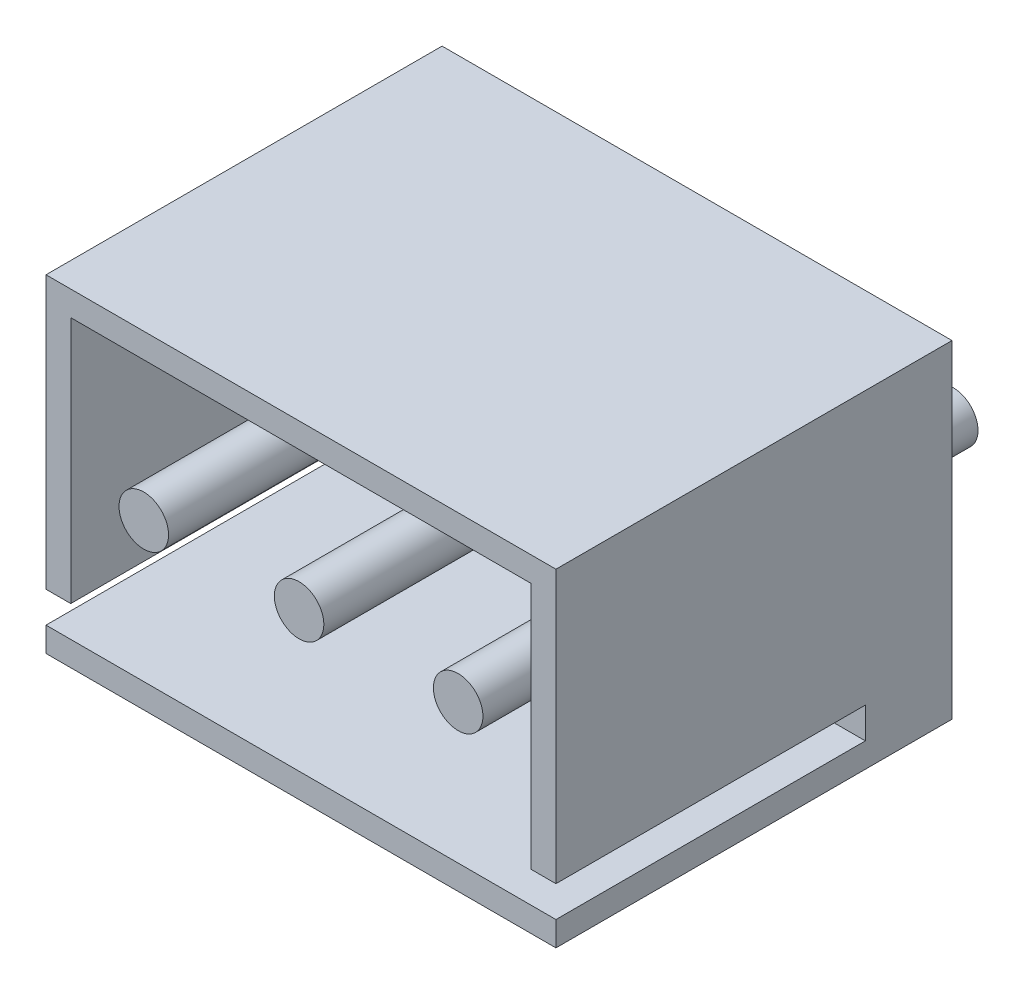
ISO-10303-21;
HEADER;
FILE_DESCRIPTION(('STEP AP214'),'2;1');
FILE_NAME('part.step','',(''),(''),'','','');
FILE_SCHEMA(('AUTOMOTIVE_DESIGN { 1 0 10303 214 1 1 1 1 }'));
ENDSEC;
DATA;
#1=APPLICATION_CONTEXT('core data for automotive mechanical design processes');
#2=APPLICATION_PROTOCOL_DEFINITION('international standard','automotive_design',2000,#1);
#3=PRODUCT_CONTEXT('',#1,'mechanical');
#4=PRODUCT('Part','Part','',(#3));
#5=PRODUCT_RELATED_PRODUCT_CATEGORY('part','',(#4));
#6=PRODUCT_DEFINITION_FORMATION('','',#4);
#7=PRODUCT_DEFINITION_CONTEXT('part definition',#1,'design');
#8=PRODUCT_DEFINITION('design','',#6,#7);
#9=PRODUCT_DEFINITION_SHAPE('','',#8);
#10=(LENGTH_UNIT() NAMED_UNIT(*) SI_UNIT(.MILLI.,.METRE.));
#11=(NAMED_UNIT(*) PLANE_ANGLE_UNIT() SI_UNIT($,.RADIAN.));
#12=(NAMED_UNIT(*) SI_UNIT($,.STERADIAN.) SOLID_ANGLE_UNIT());
#13=UNCERTAINTY_MEASURE_WITH_UNIT(LENGTH_MEASURE(1.E-05),#10,'distance_accuracy_value','');
#14=(GEOMETRIC_REPRESENTATION_CONTEXT(3) GLOBAL_UNCERTAINTY_ASSIGNED_CONTEXT((#13)) GLOBAL_UNIT_ASSIGNED_CONTEXT((#10,
#11,#12)) REPRESENTATION_CONTEXT('',''));
#15=CARTESIAN_POINT('',(0.,0.,0.));
#16=DIRECTION('',(0.,0.,1.));
#17=DIRECTION('',(1.,0.,0.));
#18=AXIS2_PLACEMENT_3D('',#15,#16,#17);
#19=CARTESIAN_POINT('',(-4.12,2.65,6.4));
#20=DIRECTION('',(0.,0.,1.));
#21=DIRECTION('',(1.,0.,0.));
#22=AXIS2_PLACEMENT_3D('',#19,#20,#21);
#23=PLANE('',#22);
#24=DIRECTION('',(1.,0.,0.));
#25=VECTOR('',#24,1.);
#26=CARTESIAN_POINT('',(-4.8996309495557,-2.25284277885296,6.4));
#27=LINE('',#26,#25);
#28=CARTESIAN_POINT('',(-4.12,-2.25284277885296,6.4));
#29=VERTEX_POINT('',#28);
#30=CARTESIAN_POINT('',(4.12000000000001,-2.25284277885296,6.4));
#31=VERTEX_POINT('',#30);
#32=EDGE_CURVE('E306',#29,#31,#27,.T.);
#33=ORIENTED_EDGE('',*,*,#32,.F.);
#34=DIRECTION('',(0.,-1.,0.));
#35=VECTOR('',#34,1.);
#36=CARTESIAN_POINT('',(-4.12,2.65,6.4));
#37=LINE('',#36,#35);
#38=CARTESIAN_POINT('',(-4.12,-2.65,6.4));
#39=VERTEX_POINT('',#38);
#40=EDGE_CURVE('E80',#29,#39,#37,.T.);
#41=ORIENTED_EDGE('',*,*,#40,.T.);
#42=DIRECTION('',(1.,0.,0.));
#43=VECTOR('',#42,1.);
#44=CARTESIAN_POINT('',(-4.12,-2.65,6.4));
#45=LINE('',#44,#43);
#46=CARTESIAN_POINT('',(4.12,-2.65,6.4));
#47=VERTEX_POINT('',#46);
#48=EDGE_CURVE('E214',#39,#47,#45,.T.);
#49=ORIENTED_EDGE('',*,*,#48,.T.);
#50=DIRECTION('',(0.,1.,0.));
#51=VECTOR('',#50,1.);
#52=CARTESIAN_POINT('',(4.12000000000001,2.65,6.4));
#53=LINE('',#52,#51);
#54=EDGE_CURVE('E216',#47,#31,#53,.T.);
#55=ORIENTED_EDGE('',*,*,#54,.T.);
#56=EDGE_LOOP('',(#33,#41,#49,#55));
#57=FACE_BOUND('',#56,.T.);
#58=ADVANCED_FACE('F31',(#57),#23,.T.);
#59=CARTESIAN_POINT('',(-4.12,2.65,6.4));
#60=DIRECTION('',(1.,0.,0.));
#61=DIRECTION('',(0.,1.,0.));
#62=AXIS2_PLACEMENT_3D('',#59,#60,#61);
#63=PLANE('',#62);
#64=ORIENTED_EDGE('',*,*,#40,.F.);
#65=DIRECTION('',(0.,0.,-1.));
#66=VECTOR('',#65,1.);
#67=CARTESIAN_POINT('',(-4.12,-2.25284277885296,6.4));
#68=LINE('',#67,#66);
#69=CARTESIAN_POINT('',(-4.12,-2.25284277885296,1.4));
#70=VERTEX_POINT('',#69);
#71=EDGE_CURVE('E169',#29,#70,#68,.T.);
#72=ORIENTED_EDGE('',*,*,#71,.T.);
#73=DIRECTION('',(0.,1.,0.));
#74=VECTOR('',#73,1.);
#75=CARTESIAN_POINT('',(-4.12,2.65,1.4));
#76=LINE('',#75,#74);
#77=CARTESIAN_POINT('',(-4.12,-1.75136681458889,1.4));
#78=VERTEX_POINT('',#77);
#79=EDGE_CURVE('E143',#70,#78,#76,.T.);
#80=ORIENTED_EDGE('',*,*,#79,.T.);
#81=DIRECTION('',(0.,0.,1.));
#82=VECTOR('',#81,1.);
#83=CARTESIAN_POINT('',(-4.12,-1.75136681458889,6.4));
#84=LINE('',#83,#82);
#85=CARTESIAN_POINT('',(-4.12,-1.75136681458889,6.4));
#86=VERTEX_POINT('',#85);
#87=EDGE_CURVE('E144',#78,#86,#84,.T.);
#88=ORIENTED_EDGE('',*,*,#87,.T.);
#89=CARTESIAN_POINT('',(-4.12,2.65,6.4));
#90=VERTEX_POINT('',#89);
#91=EDGE_CURVE('E212',#90,#86,#37,.T.);
#92=ORIENTED_EDGE('',*,*,#91,.F.);
#93=DIRECTION('',(0.,0.,-1.));
#94=VECTOR('',#93,1.);
#95=CARTESIAN_POINT('',(-4.12,2.65,6.4));
#96=LINE('',#95,#94);
#97=CARTESIAN_POINT('',(-4.12,2.65,0.));
#98=VERTEX_POINT('',#97);
#99=EDGE_CURVE('E220',#90,#98,#96,.T.);
#100=ORIENTED_EDGE('',*,*,#99,.T.);
#101=DIRECTION('',(0.,-1.,0.));
#102=VECTOR('',#101,1.);
#103=CARTESIAN_POINT('',(-4.12,2.65,0.));
#104=LINE('',#103,#102);
#105=CARTESIAN_POINT('',(-4.12,-2.65,0.));
#106=VERTEX_POINT('',#105);
#107=EDGE_CURVE('E209',#98,#106,#104,.T.);
#108=ORIENTED_EDGE('',*,*,#107,.T.);
#109=DIRECTION('',(0.,0.,-1.));
#110=VECTOR('',#109,1.);
#111=CARTESIAN_POINT('',(-4.12,-2.65,6.4));
#112=LINE('',#111,#110);
#113=EDGE_CURVE('E11',#39,#106,#112,.T.);
#114=ORIENTED_EDGE('',*,*,#113,.F.);
#115=EDGE_LOOP('',(#64,#72,#80,#88,#92,#100,#108,#114));
#116=FACE_BOUND('',#115,.T.);
#117=ADVANCED_FACE('F33',(#116),#63,.F.);
#118=CARTESIAN_POINT('',(-4.12,-2.65,6.4));
#119=DIRECTION('',(0.,1.,0.));
#120=DIRECTION('',(-1.,0.,0.));
#121=AXIS2_PLACEMENT_3D('',#118,#119,#120);
#122=PLANE('',#121);
#123=DIRECTION('',(1.,0.,0.));
#124=VECTOR('',#123,1.);
#125=CARTESIAN_POINT('',(-4.12,-2.65,0.));
#126=LINE('',#125,#124);
#127=CARTESIAN_POINT('',(4.12,-2.65,0.));
#128=VERTEX_POINT('',#127);
#129=EDGE_CURVE('E223',#106,#128,#126,.T.);
#130=ORIENTED_EDGE('',*,*,#129,.T.);
#131=DIRECTION('',(0.,0.,-1.));
#132=VECTOR('',#131,1.);
#133=CARTESIAN_POINT('',(4.12,-2.65,6.4));
#134=LINE('',#133,#132);
#135=EDGE_CURVE('E40',#47,#128,#134,.T.);
#136=ORIENTED_EDGE('',*,*,#135,.F.);
#137=ORIENTED_EDGE('',*,*,#48,.F.);
#138=ORIENTED_EDGE('',*,*,#113,.T.);
#139=EDGE_LOOP('',(#130,#136,#137,#138));
#140=FACE_BOUND('',#139,.T.);
#141=ADVANCED_FACE('F248',(#140),#122,.F.);
#142=CARTESIAN_POINT('',(4.12000000000001,2.65,6.4));
#143=DIRECTION('',(-1.,0.,0.));
#144=DIRECTION('',(0.,-1.,0.));
#145=AXIS2_PLACEMENT_3D('',#142,#143,#144);
#146=PLANE('',#145);
#147=DIRECTION('',(0.,-1.,0.));
#148=VECTOR('',#147,1.);
#149=CARTESIAN_POINT('',(4.12000000000001,2.65,1.4));
#150=LINE('',#149,#148);
#151=CARTESIAN_POINT('',(4.12,-1.75136681458889,1.4));
#152=VERTEX_POINT('',#151);
#153=CARTESIAN_POINT('',(4.12,-2.25284277885296,1.4));
#154=VERTEX_POINT('',#153);
#155=EDGE_CURVE('E133',#152,#154,#150,.T.);
#156=ORIENTED_EDGE('',*,*,#155,.T.);
#157=DIRECTION('',(0.,0.,1.));
#158=VECTOR('',#157,1.);
#159=CARTESIAN_POINT('',(4.12,-2.25284277885296,6.4));
#160=LINE('',#159,#158);
#161=EDGE_CURVE('E167',#154,#31,#160,.T.);
#162=ORIENTED_EDGE('',*,*,#161,.T.);
#163=ORIENTED_EDGE('',*,*,#54,.F.);
#164=ORIENTED_EDGE('',*,*,#135,.T.);
#165=DIRECTION('',(0.,1.,0.));
#166=VECTOR('',#165,1.);
#167=CARTESIAN_POINT('',(4.12000000000001,2.65,0.));
#168=LINE('',#167,#166);
#169=CARTESIAN_POINT('',(4.12000000000001,2.65,0.));
#170=VERTEX_POINT('',#169);
#171=EDGE_CURVE('E66',#128,#170,#168,.T.);
#172=ORIENTED_EDGE('',*,*,#171,.T.);
#173=DIRECTION('',(0.,0.,-1.));
#174=VECTOR('',#173,1.);
#175=CARTESIAN_POINT('',(4.12000000000001,2.65,6.4));
#176=LINE('',#175,#174);
#177=CARTESIAN_POINT('',(4.12000000000001,2.65,6.4));
#178=VERTEX_POINT('',#177);
#179=EDGE_CURVE('E228',#178,#170,#176,.T.);
#180=ORIENTED_EDGE('',*,*,#179,.F.);
#181=CARTESIAN_POINT('',(4.12000000000001,-1.75136681458889,6.4));
#182=VERTEX_POINT('',#181);
#183=EDGE_CURVE('E156',#182,#178,#53,.T.);
#184=ORIENTED_EDGE('',*,*,#183,.F.);
#185=DIRECTION('',(0.,0.,-1.));
#186=VECTOR('',#185,1.);
#187=CARTESIAN_POINT('',(4.12,-1.75136681458889,6.4));
#188=LINE('',#187,#186);
#189=EDGE_CURVE('E148',#182,#152,#188,.T.);
#190=ORIENTED_EDGE('',*,*,#189,.T.);
#191=EDGE_LOOP('',(#156,#162,#163,#164,#172,#180,#184,#190));
#192=FACE_BOUND('',#191,.T.);
#193=ADVANCED_FACE('F155',(#192),#146,.F.);
#194=CARTESIAN_POINT('',(-4.12,2.65,6.4));
#195=DIRECTION('',(0.,-1.,0.));
#196=DIRECTION('',(1.,0.,0.));
#197=AXIS2_PLACEMENT_3D('',#194,#195,#196);
#198=PLANE('',#197);
#199=DIRECTION('',(-1.,0.,0.));
#200=VECTOR('',#199,1.);
#201=CARTESIAN_POINT('',(-4.12,2.65,0.));
#202=LINE('',#201,#200);
#203=EDGE_CURVE('E72',#170,#98,#202,.T.);
#204=ORIENTED_EDGE('',*,*,#203,.T.);
#205=ORIENTED_EDGE('',*,*,#99,.F.);
#206=DIRECTION('',(-1.,0.,0.));
#207=VECTOR('',#206,1.);
#208=CARTESIAN_POINT('',(-4.12,2.65,6.4));
#209=LINE('',#208,#207);
#210=EDGE_CURVE('E48',#178,#90,#209,.T.);
#211=ORIENTED_EDGE('',*,*,#210,.F.);
#212=ORIENTED_EDGE('',*,*,#179,.T.);
#213=EDGE_LOOP('',(#204,#205,#211,#212));
#214=FACE_BOUND('',#213,.T.);
#215=ADVANCED_FACE('F238',(#214),#198,.F.);
#216=DIRECTION('',(-1.,0.,0.));
#217=VECTOR('',#216,1.);
#218=CARTESIAN_POINT('',(-4.8996309495557,-1.75136681458889,6.4));
#219=LINE('',#218,#217);
#220=CARTESIAN_POINT('',(3.72,-1.75136681458889,6.4));
#221=VERTEX_POINT('',#220);
#222=EDGE_CURVE('E305',#182,#221,#219,.T.);
#223=ORIENTED_EDGE('',*,*,#222,.F.);
#224=ORIENTED_EDGE('',*,*,#183,.T.);
#225=ORIENTED_EDGE('',*,*,#210,.T.);
#226=ORIENTED_EDGE('',*,*,#91,.T.);
#227=CARTESIAN_POINT('',(-3.72,-1.75136681458889,6.4));
#228=VERTEX_POINT('',#227);
#229=EDGE_CURVE('E303',#228,#86,#219,.T.);
#230=ORIENTED_EDGE('',*,*,#229,.F.);
#231=DIRECTION('',(0.,-1.,0.));
#232=VECTOR('',#231,1.);
#233=CARTESIAN_POINT('',(-3.72,2.25,6.4));
#234=LINE('',#233,#232);
#235=CARTESIAN_POINT('',(-3.72,2.25,6.4));
#236=VERTEX_POINT('',#235);
#237=EDGE_CURVE('E188',#236,#228,#234,.T.);
#238=ORIENTED_EDGE('',*,*,#237,.F.);
#239=DIRECTION('',(-1.,0.,0.));
#240=VECTOR('',#239,1.);
#241=CARTESIAN_POINT('',(3.72000000000001,2.25,6.4));
#242=LINE('',#241,#240);
#243=CARTESIAN_POINT('',(3.72000000000001,2.25,6.4));
#244=VERTEX_POINT('',#243);
#245=EDGE_CURVE('E195',#244,#236,#242,.T.);
#246=ORIENTED_EDGE('',*,*,#245,.F.);
#247=DIRECTION('',(0.,1.,0.));
#248=VECTOR('',#247,1.);
#249=CARTESIAN_POINT('',(3.72,-2.25,6.4));
#250=LINE('',#249,#248);
#251=EDGE_CURVE('E203',#221,#244,#250,.T.);
#252=ORIENTED_EDGE('',*,*,#251,.F.);
#253=EDGE_LOOP('',(#223,#224,#225,#226,#230,#238,#246,#252));
#254=FACE_BOUND('',#253,.T.);
#255=ADVANCED_FACE('F240',(#254),#23,.T.);
#256=CARTESIAN_POINT('',(-4.12,2.65,0.));
#257=DIRECTION('',(0.,0.,1.));
#258=DIRECTION('',(1.,0.,0.));
#259=AXIS2_PLACEMENT_3D('',#256,#257,#258);
#260=PLANE('',#259);
#261=CARTESIAN_POINT('',(-0.030392482682667,0.,0.));
#262=DIRECTION('',(0.,0.,1.));
#263=DIRECTION('',(1.,0.,0.));
#264=AXIS2_PLACEMENT_3D('',#261,#262,#263);
#265=CIRCLE('',#264,0.4);
#266=CARTESIAN_POINT('',(0.369607517317333,0.,0.));
#267=VERTEX_POINT('',#266);
#268=EDGE_CURVE('E516',#267,#267,#265,.T.);
#269=ORIENTED_EDGE('',*,*,#268,.T.);
#270=EDGE_LOOP('',(#269));
#271=FACE_BOUND('',#270,.T.);
#272=CARTESIAN_POINT('',(2.54,0.,0.));
#273=DIRECTION('',(0.,0.,1.));
#274=DIRECTION('',(1.,0.,0.));
#275=AXIS2_PLACEMENT_3D('',#272,#273,#274);
#276=CIRCLE('',#275,0.4);
#277=CARTESIAN_POINT('',(2.94,0.,0.));
#278=VERTEX_POINT('',#277);
#279=EDGE_CURVE('E524',#278,#278,#276,.T.);
#280=ORIENTED_EDGE('',*,*,#279,.T.);
#281=EDGE_LOOP('',(#280));
#282=FACE_BOUND('',#281,.T.);
#283=CARTESIAN_POINT('',(-2.54,0.,0.));
#284=DIRECTION('',(0.,0.,1.));
#285=DIRECTION('',(1.,0.,0.));
#286=AXIS2_PLACEMENT_3D('',#283,#284,#285);
#287=CIRCLE('',#286,0.4);
#288=CARTESIAN_POINT('',(-2.14,0.,0.));
#289=VERTEX_POINT('',#288);
#290=EDGE_CURVE('E308',#289,#289,#287,.T.);
#291=ORIENTED_EDGE('',*,*,#290,.T.);
#292=EDGE_LOOP('',(#291));
#293=FACE_BOUND('',#292,.T.);
#294=ORIENTED_EDGE('',*,*,#107,.F.);
#295=ORIENTED_EDGE('',*,*,#203,.F.);
#296=ORIENTED_EDGE('',*,*,#171,.F.);
#297=ORIENTED_EDGE('',*,*,#129,.F.);
#298=EDGE_LOOP('',(#294,#295,#296,#297));
#299=FACE_BOUND('',#298,.T.);
#300=ADVANCED_FACE('F234',(#271,#282,#293,#299),#260,.F.);
#301=CARTESIAN_POINT('',(-3.72,2.25,1.4));
#302=DIRECTION('',(-1.,0.,0.));
#303=DIRECTION('',(0.,-1.,0.));
#304=AXIS2_PLACEMENT_3D('',#301,#302,#303);
#305=PLANE('',#304);
#306=ORIENTED_EDGE('',*,*,#237,.T.);
#307=DIRECTION('',(0.,0.,-1.));
#308=VECTOR('',#307,1.);
#309=CARTESIAN_POINT('',(-3.72,-1.75136681458889,1.4));
#310=LINE('',#309,#308);
#311=CARTESIAN_POINT('',(-3.72,-1.75136681458889,1.4));
#312=VERTEX_POINT('',#311);
#313=EDGE_CURVE('E157',#228,#312,#310,.T.);
#314=ORIENTED_EDGE('',*,*,#313,.T.);
#315=DIRECTION('',(0.,-1.,0.));
#316=VECTOR('',#315,1.);
#317=CARTESIAN_POINT('',(-3.72,2.25,1.4));
#318=LINE('',#317,#316);
#319=CARTESIAN_POINT('',(-3.72,2.25,1.4));
#320=VERTEX_POINT('',#319);
#321=EDGE_CURVE('E191',#320,#312,#318,.T.);
#322=ORIENTED_EDGE('',*,*,#321,.F.);
#323=DIRECTION('',(0.,0.,1.));
#324=VECTOR('',#323,1.);
#325=CARTESIAN_POINT('',(-3.72,2.25,1.4));
#326=LINE('',#325,#324);
#327=EDGE_CURVE('E207',#320,#236,#326,.T.);
#328=ORIENTED_EDGE('',*,*,#327,.T.);
#329=EDGE_LOOP('',(#306,#314,#322,#328));
#330=FACE_BOUND('',#329,.T.);
#331=ADVANCED_FACE('F288',(#330),#305,.F.);
#332=CARTESIAN_POINT('',(3.72000000000001,2.25,1.4));
#333=DIRECTION('',(0.,1.,0.));
#334=DIRECTION('',(-1.,0.,0.));
#335=AXIS2_PLACEMENT_3D('',#332,#333,#334);
#336=PLANE('',#335);
#337=ORIENTED_EDGE('',*,*,#245,.T.);
#338=ORIENTED_EDGE('',*,*,#327,.F.);
#339=DIRECTION('',(-1.,0.,0.));
#340=VECTOR('',#339,1.);
#341=CARTESIAN_POINT('',(3.72000000000001,2.25,1.4));
#342=LINE('',#341,#340);
#343=CARTESIAN_POINT('',(3.72000000000001,2.25,1.4));
#344=VERTEX_POINT('',#343);
#345=EDGE_CURVE('E197',#344,#320,#342,.T.);
#346=ORIENTED_EDGE('',*,*,#345,.F.);
#347=DIRECTION('',(0.,0.,1.));
#348=VECTOR('',#347,1.);
#349=CARTESIAN_POINT('',(3.72000000000001,2.25,1.4));
#350=LINE('',#349,#348);
#351=EDGE_CURVE('E200',#344,#244,#350,.T.);
#352=ORIENTED_EDGE('',*,*,#351,.T.);
#353=EDGE_LOOP('',(#337,#338,#346,#352));
#354=FACE_BOUND('',#353,.T.);
#355=ADVANCED_FACE('F285',(#354),#336,.F.);
#356=CARTESIAN_POINT('',(3.72,-2.25,1.4));
#357=DIRECTION('',(1.,0.,0.));
#358=DIRECTION('',(0.,1.,0.));
#359=AXIS2_PLACEMENT_3D('',#356,#357,#358);
#360=PLANE('',#359);
#361=DIRECTION('',(0.,1.,0.));
#362=VECTOR('',#361,1.);
#363=CARTESIAN_POINT('',(3.72,-2.25,1.4));
#364=LINE('',#363,#362);
#365=CARTESIAN_POINT('',(3.72000000000001,-1.75136681458889,1.4));
#366=VERTEX_POINT('',#365);
#367=EDGE_CURVE('E194',#366,#344,#364,.T.);
#368=ORIENTED_EDGE('',*,*,#367,.F.);
#369=DIRECTION('',(0.,0.,1.));
#370=VECTOR('',#369,1.);
#371=CARTESIAN_POINT('',(3.72,-1.75136681458889,1.4));
#372=LINE('',#371,#370);
#373=EDGE_CURVE('E151',#366,#221,#372,.T.);
#374=ORIENTED_EDGE('',*,*,#373,.T.);
#375=ORIENTED_EDGE('',*,*,#251,.T.);
#376=ORIENTED_EDGE('',*,*,#351,.F.);
#377=EDGE_LOOP('',(#368,#374,#375,#376));
#378=FACE_BOUND('',#377,.T.);
#379=ADVANCED_FACE('F281',(#378),#360,.F.);
#380=CARTESIAN_POINT('',(-3.72,2.25,1.4));
#381=DIRECTION('',(0.,0.,-1.));
#382=DIRECTION('',(-1.,0.,0.));
#383=AXIS2_PLACEMENT_3D('',#380,#381,#382);
#384=PLANE('',#383);
#385=DIRECTION('',(-1.,0.,0.));
#386=VECTOR('',#385,1.);
#387=CARTESIAN_POINT('',(-4.8996309495557,-1.75136681458889,1.4));
#388=LINE('',#387,#386);
#389=EDGE_CURVE('E137',#152,#366,#388,.T.);
#390=ORIENTED_EDGE('',*,*,#389,.T.);
#391=ORIENTED_EDGE('',*,*,#367,.T.);
#392=ORIENTED_EDGE('',*,*,#345,.T.);
#393=ORIENTED_EDGE('',*,*,#321,.T.);
#394=EDGE_CURVE('E152',#312,#78,#388,.T.);
#395=ORIENTED_EDGE('',*,*,#394,.T.);
#396=ORIENTED_EDGE('',*,*,#79,.F.);
#397=DIRECTION('',(1.,0.,0.));
#398=VECTOR('',#397,1.);
#399=CARTESIAN_POINT('',(-4.8996309495557,-2.25284277885296,1.4));
#400=LINE('',#399,#398);
#401=EDGE_CURVE('E140',#70,#154,#400,.T.);
#402=ORIENTED_EDGE('',*,*,#401,.T.);
#403=ORIENTED_EDGE('',*,*,#155,.F.);
#404=EDGE_LOOP('',(#390,#391,#392,#393,#395,#396,#402,#403));
#405=FACE_BOUND('',#404,.T.);
#406=CARTESIAN_POINT('',(-0.030392482682667,0.,1.4));
#407=DIRECTION('',(0.,0.,1.));
#408=DIRECTION('',(1.,0.,0.));
#409=AXIS2_PLACEMENT_3D('',#406,#407,#408);
#410=CIRCLE('',#409,0.4);
#411=CARTESIAN_POINT('',(0.369607517317333,0.,1.4));
#412=VERTEX_POINT('',#411);
#413=EDGE_CURVE('E173',#412,#412,#410,.T.);
#414=ORIENTED_EDGE('',*,*,#413,.F.);
#415=EDGE_LOOP('',(#414));
#416=FACE_BOUND('',#415,.T.);
#417=CARTESIAN_POINT('',(2.54,0.,1.4));
#418=DIRECTION('',(0.,0.,1.));
#419=DIRECTION('',(1.,0.,0.));
#420=AXIS2_PLACEMENT_3D('',#417,#418,#419);
#421=CIRCLE('',#420,0.4);
#422=CARTESIAN_POINT('',(2.94,0.,1.4));
#423=VERTEX_POINT('',#422);
#424=EDGE_CURVE('E179',#423,#423,#421,.T.);
#425=ORIENTED_EDGE('',*,*,#424,.F.);
#426=EDGE_LOOP('',(#425));
#427=FACE_BOUND('',#426,.T.);
#428=CARTESIAN_POINT('',(-2.54,0.,1.4));
#429=DIRECTION('',(0.,0.,1.));
#430=DIRECTION('',(1.,0.,0.));
#431=AXIS2_PLACEMENT_3D('',#428,#429,#430);
#432=CIRCLE('',#431,0.4);
#433=CARTESIAN_POINT('',(-2.14,0.,1.4));
#434=VERTEX_POINT('',#433);
#435=EDGE_CURVE('E185',#434,#434,#432,.T.);
#436=ORIENTED_EDGE('',*,*,#435,.F.);
#437=EDGE_LOOP('',(#436));
#438=FACE_BOUND('',#437,.T.);
#439=ADVANCED_FACE('F135',(#405,#416,#427,#438),#384,.F.);
#440=CARTESIAN_POINT('',(-2.54,0.,1.4));
#441=DIRECTION('',(0.,0.,1.));
#442=DIRECTION('',(1.,0.,0.));
#443=AXIS2_PLACEMENT_3D('',#440,#441,#442);
#444=CYLINDRICAL_SURFACE('',#443,0.4);
#445=ORIENTED_EDGE('',*,*,#435,.T.);
#446=EDGE_LOOP('',(#445));
#447=FACE_BOUND('',#446,.T.);
#448=CARTESIAN_POINT('',(-2.54,0.,6.4));
#449=DIRECTION('',(0.,0.,1.));
#450=DIRECTION('',(1.,0.,0.));
#451=AXIS2_PLACEMENT_3D('',#448,#449,#450);
#452=CIRCLE('',#451,0.4);
#453=CARTESIAN_POINT('',(-2.14,0.,6.4));
#454=VERTEX_POINT('',#453);
#455=EDGE_CURVE('E182',#454,#454,#452,.T.);
#456=ORIENTED_EDGE('',*,*,#455,.F.);
#457=EDGE_LOOP('',(#456));
#458=FACE_BOUND('',#457,.T.);
#459=ADVANCED_FACE('F270',(#447,#458),#444,.T.);
#460=CARTESIAN_POINT('',(2.54,0.,1.4));
#461=DIRECTION('',(0.,0.,1.));
#462=DIRECTION('',(1.,0.,0.));
#463=AXIS2_PLACEMENT_3D('',#460,#461,#462);
#464=CYLINDRICAL_SURFACE('',#463,0.4);
#465=ORIENTED_EDGE('',*,*,#424,.T.);
#466=EDGE_LOOP('',(#465));
#467=FACE_BOUND('',#466,.T.);
#468=CARTESIAN_POINT('',(2.54,0.,6.4));
#469=DIRECTION('',(0.,0.,1.));
#470=DIRECTION('',(1.,0.,0.));
#471=AXIS2_PLACEMENT_3D('',#468,#469,#470);
#472=CIRCLE('',#471,0.4);
#473=CARTESIAN_POINT('',(2.94,0.,6.4));
#474=VERTEX_POINT('',#473);
#475=EDGE_CURVE('E176',#474,#474,#472,.T.);
#476=ORIENTED_EDGE('',*,*,#475,.F.);
#477=EDGE_LOOP('',(#476));
#478=FACE_BOUND('',#477,.T.);
#479=ADVANCED_FACE('F272',(#467,#478),#464,.T.);
#480=CARTESIAN_POINT('',(-0.030392482682667,0.,1.4));
#481=DIRECTION('',(0.,0.,1.));
#482=DIRECTION('',(1.,0.,0.));
#483=AXIS2_PLACEMENT_3D('',#480,#481,#482);
#484=CYLINDRICAL_SURFACE('',#483,0.4);
#485=ORIENTED_EDGE('',*,*,#413,.T.);
#486=EDGE_LOOP('',(#485));
#487=FACE_BOUND('',#486,.T.);
#488=CARTESIAN_POINT('',(-0.030392482682667,0.,6.4));
#489=DIRECTION('',(0.,0.,1.));
#490=DIRECTION('',(1.,0.,0.));
#491=AXIS2_PLACEMENT_3D('',#488,#489,#490);
#492=CIRCLE('',#491,0.4);
#493=CARTESIAN_POINT('',(0.369607517317333,0.,6.4));
#494=VERTEX_POINT('',#493);
#495=EDGE_CURVE('E172',#494,#494,#492,.T.);
#496=ORIENTED_EDGE('',*,*,#495,.F.);
#497=EDGE_LOOP('',(#496));
#498=FACE_BOUND('',#497,.T.);
#499=ADVANCED_FACE('F266',(#487,#498),#484,.T.);
#500=ORIENTED_EDGE('',*,*,#475,.T.);
#501=EDGE_LOOP('',(#500));
#502=FACE_BOUND('',#501,.T.);
#503=ADVANCED_FACE('F258',(#502),#23,.T.);
#504=ORIENTED_EDGE('',*,*,#455,.T.);
#505=EDGE_LOOP('',(#504));
#506=FACE_BOUND('',#505,.T.);
#507=ADVANCED_FACE('F252',(#506),#23,.T.);
#508=ORIENTED_EDGE('',*,*,#495,.T.);
#509=EDGE_LOOP('',(#508));
#510=FACE_BOUND('',#509,.T.);
#511=ADVANCED_FACE('F247',(#510),#23,.T.);
#512=CARTESIAN_POINT('',(-4.8996309495557,-2.25284277885296,-8.3112877748024));
#513=DIRECTION('',(0.,-1.,0.));
#514=DIRECTION('',(0.,0.,-1.));
#515=AXIS2_PLACEMENT_3D('',#512,#513,#514);
#516=PLANE('',#515);
#517=ORIENTED_EDGE('',*,*,#32,.T.);
#518=ORIENTED_EDGE('',*,*,#161,.F.);
#519=ORIENTED_EDGE('',*,*,#401,.F.);
#520=ORIENTED_EDGE('',*,*,#71,.F.);
#521=EDGE_LOOP('',(#517,#518,#519,#520));
#522=FACE_BOUND('',#521,.T.);
#523=ADVANCED_FACE('F264',(#522),#516,.F.);
#524=CARTESIAN_POINT('',(-4.8996309495557,-1.75136681458889,-8.3112877748024));
#525=DIRECTION('',(0.,1.,0.));
#526=DIRECTION('',(0.,0.,1.));
#527=AXIS2_PLACEMENT_3D('',#524,#525,#526);
#528=PLANE('',#527);
#529=ORIENTED_EDGE('',*,*,#394,.F.);
#530=ORIENTED_EDGE('',*,*,#313,.F.);
#531=ORIENTED_EDGE('',*,*,#229,.T.);
#532=ORIENTED_EDGE('',*,*,#87,.F.);
#533=EDGE_LOOP('',(#529,#530,#531,#532));
#534=FACE_BOUND('',#533,.T.);
#535=ADVANCED_FACE('F366',(#534),#528,.F.);
#536=ORIENTED_EDGE('',*,*,#222,.T.);
#537=ORIENTED_EDGE('',*,*,#373,.F.);
#538=ORIENTED_EDGE('',*,*,#389,.F.);
#539=ORIENTED_EDGE('',*,*,#189,.F.);
#540=EDGE_LOOP('',(#536,#537,#538,#539));
#541=FACE_BOUND('',#540,.T.);
#542=ADVANCED_FACE('F147',(#541),#528,.F.);
#543=CARTESIAN_POINT('',(-2.54,0.,-1.6));
#544=DIRECTION('',(0.,0.,1.));
#545=DIRECTION('',(1.,0.,0.));
#546=AXIS2_PLACEMENT_3D('',#543,#544,#545);
#547=CYLINDRICAL_SURFACE('',#546,0.4);
#548=CARTESIAN_POINT('',(-2.54,0.,-1.6));
#549=DIRECTION('',(0.,0.,1.));
#550=DIRECTION('',(1.,0.,0.));
#551=AXIS2_PLACEMENT_3D('',#548,#549,#550);
#552=CIRCLE('',#551,0.4);
#553=CARTESIAN_POINT('',(-2.14,0.,-1.6));
#554=VERTEX_POINT('',#553);
#555=EDGE_CURVE('E526',#554,#554,#552,.T.);
#556=ORIENTED_EDGE('',*,*,#555,.T.);
#557=EDGE_LOOP('',(#556));
#558=FACE_BOUND('',#557,.T.);
#559=ORIENTED_EDGE('',*,*,#290,.F.);
#560=EDGE_LOOP('',(#559));
#561=FACE_BOUND('',#560,.T.);
#562=ADVANCED_FACE('F383',(#558,#561),#547,.T.);
#563=CARTESIAN_POINT('',(-2.54,0.,-1.6));
#564=DIRECTION('',(0.,0.,1.));
#565=DIRECTION('',(1.,0.,0.));
#566=AXIS2_PLACEMENT_3D('',#563,#564,#565);
#567=PLANE('',#566);
#568=ORIENTED_EDGE('',*,*,#555,.F.);
#569=EDGE_LOOP('',(#568));
#570=FACE_BOUND('',#569,.T.);
#571=ADVANCED_FACE('F397',(#570),#567,.F.);
#572=CARTESIAN_POINT('',(2.54,0.,-1.6));
#573=DIRECTION('',(0.,0.,1.));
#574=DIRECTION('',(1.,0.,0.));
#575=AXIS2_PLACEMENT_3D('',#572,#573,#574);
#576=CYLINDRICAL_SURFACE('',#575,0.4);
#577=CARTESIAN_POINT('',(2.54,0.,-1.6));
#578=DIRECTION('',(0.,0.,1.));
#579=DIRECTION('',(1.,0.,0.));
#580=AXIS2_PLACEMENT_3D('',#577,#578,#579);
#581=CIRCLE('',#580,0.4);
#582=CARTESIAN_POINT('',(2.94,0.,-1.6));
#583=VERTEX_POINT('',#582);
#584=EDGE_CURVE('E519',#583,#583,#581,.T.);
#585=ORIENTED_EDGE('',*,*,#584,.T.);
#586=EDGE_LOOP('',(#585));
#587=FACE_BOUND('',#586,.T.);
#588=ORIENTED_EDGE('',*,*,#279,.F.);
#589=EDGE_LOOP('',(#588));
#590=FACE_BOUND('',#589,.T.);
#591=ADVANCED_FACE('F407',(#587,#590),#576,.T.);
#592=CARTESIAN_POINT('',(2.54,0.,-1.6));
#593=DIRECTION('',(0.,0.,1.));
#594=DIRECTION('',(1.,0.,0.));
#595=AXIS2_PLACEMENT_3D('',#592,#593,#594);
#596=PLANE('',#595);
#597=ORIENTED_EDGE('',*,*,#584,.F.);
#598=EDGE_LOOP('',(#597));
#599=FACE_BOUND('',#598,.T.);
#600=ADVANCED_FACE('F417',(#599),#596,.F.);
#601=CARTESIAN_POINT('',(-0.030392482682667,0.,-1.6));
#602=DIRECTION('',(0.,0.,1.));
#603=DIRECTION('',(1.,0.,0.));
#604=AXIS2_PLACEMENT_3D('',#601,#602,#603);
#605=CYLINDRICAL_SURFACE('',#604,0.4);
#606=CARTESIAN_POINT('',(-0.030392482682667,0.,-1.6));
#607=DIRECTION('',(0.,0.,1.));
#608=DIRECTION('',(1.,0.,0.));
#609=AXIS2_PLACEMENT_3D('',#606,#607,#608);
#610=CIRCLE('',#609,0.4);
#611=CARTESIAN_POINT('',(0.369607517317333,0.,-1.6));
#612=VERTEX_POINT('',#611);
#613=EDGE_CURVE('E515',#612,#612,#610,.T.);
#614=ORIENTED_EDGE('',*,*,#613,.T.);
#615=EDGE_LOOP('',(#614));
#616=FACE_BOUND('',#615,.T.);
#617=ORIENTED_EDGE('',*,*,#268,.F.);
#618=EDGE_LOOP('',(#617));
#619=FACE_BOUND('',#618,.T.);
#620=ADVANCED_FACE('F427',(#616,#619),#605,.T.);
#621=CARTESIAN_POINT('',(-0.030392482682667,0.,-1.6));
#622=DIRECTION('',(0.,0.,1.));
#623=DIRECTION('',(1.,0.,0.));
#624=AXIS2_PLACEMENT_3D('',#621,#622,#623);
#625=PLANE('',#624);
#626=ORIENTED_EDGE('',*,*,#613,.F.);
#627=EDGE_LOOP('',(#626));
#628=FACE_BOUND('',#627,.T.);
#629=ADVANCED_FACE('F437',(#628),#625,.F.);
#630=CLOSED_SHELL('',(#58,#117,#141,#193,#215,#255,#300,#331,#355,#379,#439,#459,#479,#499,#503,
#507,#511,#523,#535,#542,#562,#571,#591,#600,#620,#629));
#631=MANIFOLD_SOLID_BREP('B2',#630);
#632=ADVANCED_BREP_SHAPE_REPRESENTATION('',(#18,#631),#14);
#633=SHAPE_DEFINITION_REPRESENTATION(#9,#632);
ENDSEC;
END-ISO-10303-21;
